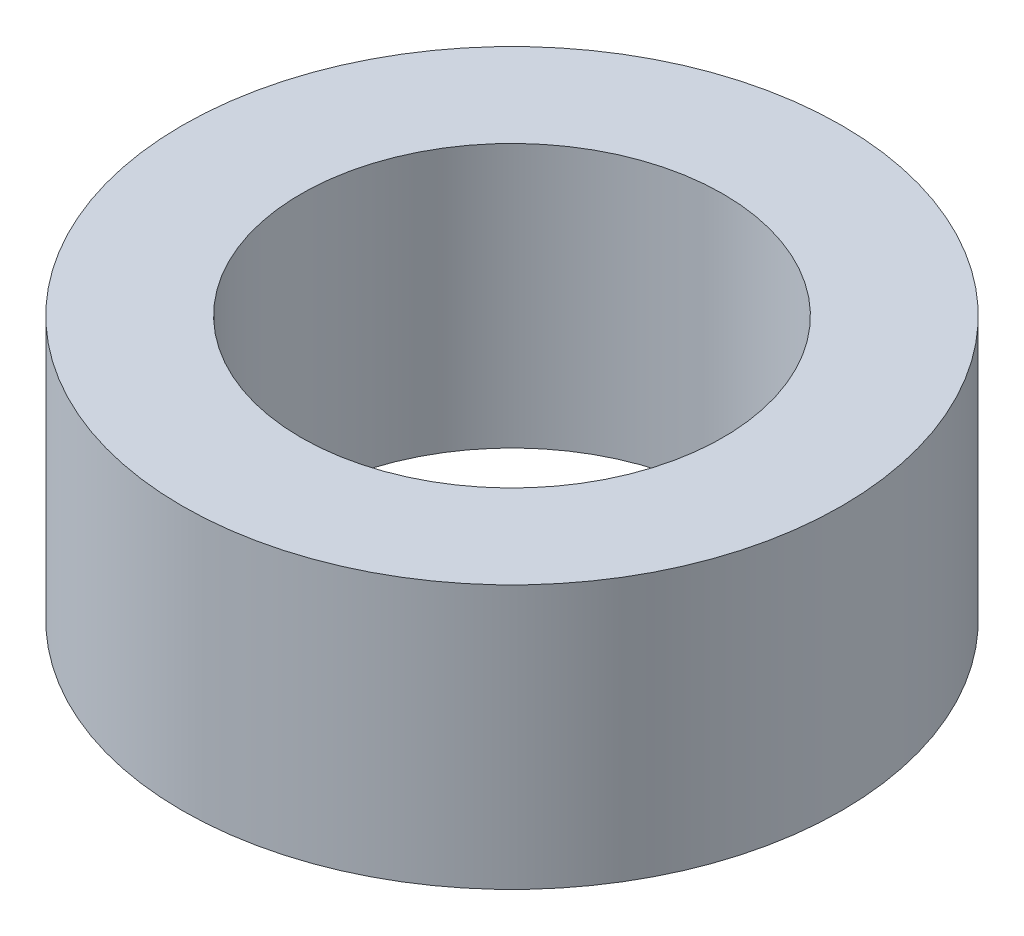
ISO-10303-21;
HEADER;
FILE_DESCRIPTION(('STEP AP214'),'2;1');
FILE_NAME('part.step','',(''),(''),'','','');
FILE_SCHEMA(('AUTOMOTIVE_DESIGN { 1 0 10303 214 1 1 1 1 }'));
ENDSEC;
DATA;
#1=APPLICATION_CONTEXT('core data for automotive mechanical design processes');
#2=APPLICATION_PROTOCOL_DEFINITION('international standard','automotive_design',2000,#1);
#3=PRODUCT_CONTEXT('',#1,'mechanical');
#4=PRODUCT('Part','Part','',(#3));
#5=PRODUCT_RELATED_PRODUCT_CATEGORY('part','',(#4));
#6=PRODUCT_DEFINITION_FORMATION('','',#4);
#7=PRODUCT_DEFINITION_CONTEXT('part definition',#1,'design');
#8=PRODUCT_DEFINITION('design','',#6,#7);
#9=PRODUCT_DEFINITION_SHAPE('','',#8);
#10=(LENGTH_UNIT() NAMED_UNIT(*) SI_UNIT(.MILLI.,.METRE.));
#11=(NAMED_UNIT(*) PLANE_ANGLE_UNIT() SI_UNIT($,.RADIAN.));
#12=(NAMED_UNIT(*) SI_UNIT($,.STERADIAN.) SOLID_ANGLE_UNIT());
#13=UNCERTAINTY_MEASURE_WITH_UNIT(LENGTH_MEASURE(1.E-05),#10,'distance_accuracy_value','');
#14=(GEOMETRIC_REPRESENTATION_CONTEXT(3) GLOBAL_UNCERTAINTY_ASSIGNED_CONTEXT((#13)) GLOBAL_UNIT_ASSIGNED_CONTEXT((#10,
#11,#12)) REPRESENTATION_CONTEXT('',''));
#15=CARTESIAN_POINT('',(0.,0.,0.));
#16=DIRECTION('',(0.,0.,1.));
#17=DIRECTION('',(1.,0.,0.));
#18=AXIS2_PLACEMENT_3D('',#15,#16,#17);
#19=CARTESIAN_POINT('',(0.,20.,0.));
#20=DIRECTION('',(0.,-1.,0.));
#21=DIRECTION('',(0.,0.,-1.));
#22=AXIS2_PLACEMENT_3D('',#19,#20,#21);
#23=CYLINDRICAL_SURFACE('',#22,25.);
#24=CARTESIAN_POINT('',(0.,20.,0.));
#25=DIRECTION('',(0.,1.,0.));
#26=DIRECTION('',(0.,0.,1.));
#27=AXIS2_PLACEMENT_3D('',#24,#25,#26);
#28=CIRCLE('',#27,25.);
#29=CARTESIAN_POINT('',(0.,20.,25.));
#30=VERTEX_POINT('',#29);
#31=EDGE_CURVE('E10',#30,#30,#28,.T.);
#32=ORIENTED_EDGE('',*,*,#31,.F.);
#33=EDGE_LOOP('',(#32));
#34=FACE_BOUND('',#33,.T.);
#35=CARTESIAN_POINT('',(0.,0.,0.));
#36=DIRECTION('',(0.,1.,0.));
#37=DIRECTION('',(0.,0.,1.));
#38=AXIS2_PLACEMENT_3D('',#35,#36,#37);
#39=CIRCLE('',#38,25.);
#40=CARTESIAN_POINT('',(0.,0.,25.));
#41=VERTEX_POINT('',#40);
#42=EDGE_CURVE('E34',#41,#41,#39,.T.);
#43=ORIENTED_EDGE('',*,*,#42,.T.);
#44=EDGE_LOOP('',(#43));
#45=FACE_BOUND('',#44,.T.);
#46=ADVANCED_FACE('F31',(#34,#45),#23,.T.);
#47=CARTESIAN_POINT('',(0.,20.,0.));
#48=DIRECTION('',(0.,1.,0.));
#49=DIRECTION('',(0.,0.,1.));
#50=AXIS2_PLACEMENT_3D('',#47,#48,#49);
#51=PLANE('',#50);
#52=CARTESIAN_POINT('',(0.,20.,0.));
#53=DIRECTION('',(0.,1.,0.));
#54=DIRECTION('',(0.,0.,1.));
#55=AXIS2_PLACEMENT_3D('',#52,#53,#54);
#56=CIRCLE('',#55,16.);
#57=CARTESIAN_POINT('',(0.,20.,16.));
#58=VERTEX_POINT('',#57);
#59=EDGE_CURVE('E43',#58,#58,#56,.T.);
#60=ORIENTED_EDGE('',*,*,#59,.F.);
#61=EDGE_LOOP('',(#60));
#62=FACE_BOUND('',#61,.T.);
#63=ORIENTED_EDGE('',*,*,#31,.T.);
#64=EDGE_LOOP('',(#63));
#65=FACE_BOUND('',#64,.T.);
#66=ADVANCED_FACE('F58',(#62,#65),#51,.T.);
#67=CARTESIAN_POINT('',(0.,0.,0.));
#68=DIRECTION('',(0.,1.,0.));
#69=DIRECTION('',(0.,0.,1.));
#70=AXIS2_PLACEMENT_3D('',#67,#68,#69);
#71=PLANE('',#70);
#72=CARTESIAN_POINT('',(0.,0.,0.));
#73=DIRECTION('',(0.,1.,0.));
#74=DIRECTION('',(0.,0.,1.));
#75=AXIS2_PLACEMENT_3D('',#72,#73,#74);
#76=CIRCLE('',#75,16.);
#77=CARTESIAN_POINT('',(0.,0.,16.));
#78=VERTEX_POINT('',#77);
#79=EDGE_CURVE('E41',#78,#78,#76,.T.);
#80=ORIENTED_EDGE('',*,*,#79,.T.);
#81=EDGE_LOOP('',(#80));
#82=FACE_BOUND('',#81,.T.);
#83=ORIENTED_EDGE('',*,*,#42,.F.);
#84=EDGE_LOOP('',(#83));
#85=FACE_BOUND('',#84,.T.);
#86=ADVANCED_FACE('F49',(#82,#85),#71,.F.);
#87=CARTESIAN_POINT('',(0.,0.,0.));
#88=DIRECTION('',(0.,1.,0.));
#89=DIRECTION('',(0.,0.,1.));
#90=AXIS2_PLACEMENT_3D('',#87,#88,#89);
#91=CYLINDRICAL_SURFACE('',#90,16.);
#92=ORIENTED_EDGE('',*,*,#79,.F.);
#93=EDGE_LOOP('',(#92));
#94=FACE_BOUND('',#93,.T.);
#95=ORIENTED_EDGE('',*,*,#59,.T.);
#96=EDGE_LOOP('',(#95));
#97=FACE_BOUND('',#96,.T.);
#98=ADVANCED_FACE('F52',(#94,#97),#91,.F.);
#99=CLOSED_SHELL('',(#46,#66,#86,#98));
#100=MANIFOLD_SOLID_BREP('B2',#99);
#101=ADVANCED_BREP_SHAPE_REPRESENTATION('',(#18,#100),#14);
#102=SHAPE_DEFINITION_REPRESENTATION(#9,#101);
ENDSEC;
END-ISO-10303-21;
